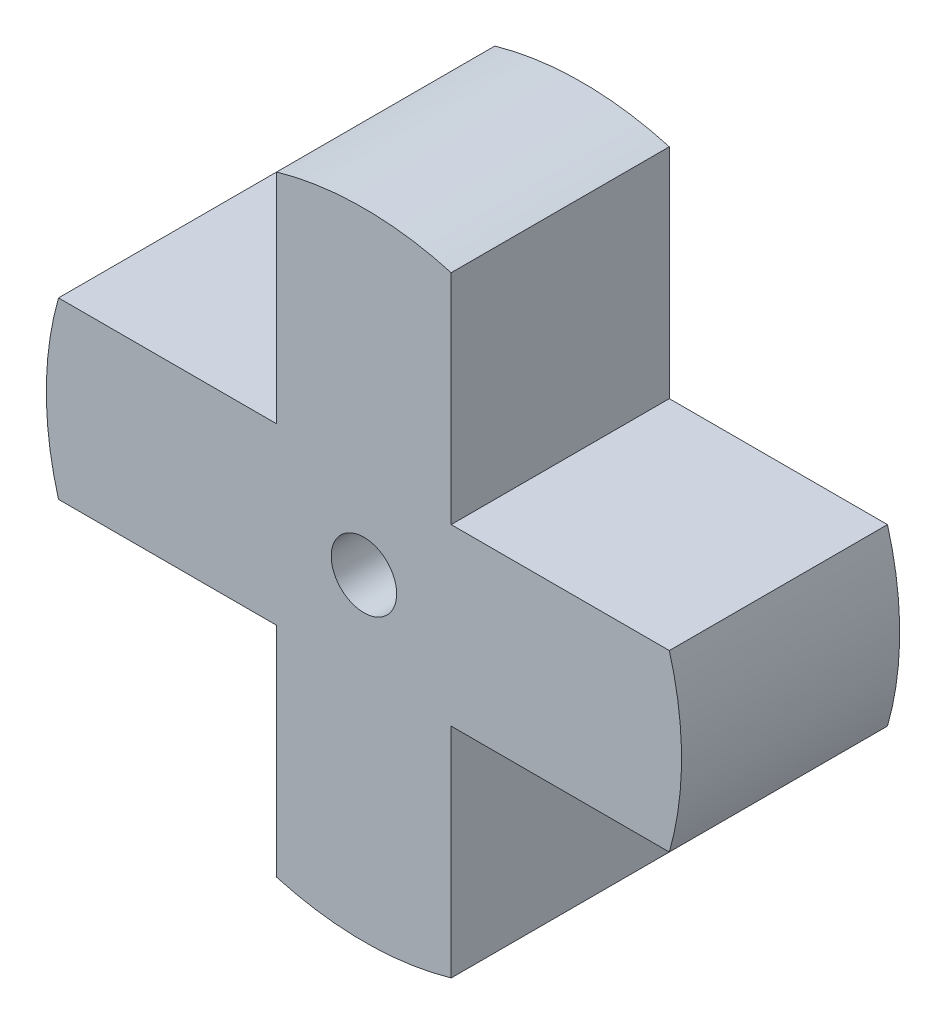
ISO-10303-21;
HEADER;
FILE_DESCRIPTION(('STEP AP214'),'2;1');
FILE_NAME('part.step','',(''),(''),'','','');
FILE_SCHEMA(('AUTOMOTIVE_DESIGN { 1 0 10303 214 1 1 1 1 }'));
ENDSEC;
DATA;
#1=APPLICATION_CONTEXT('core data for automotive mechanical design processes');
#2=APPLICATION_PROTOCOL_DEFINITION('international standard','automotive_design',2000,#1);
#3=PRODUCT_CONTEXT('',#1,'mechanical');
#4=PRODUCT('Part','Part','',(#3));
#5=PRODUCT_RELATED_PRODUCT_CATEGORY('part','',(#4));
#6=PRODUCT_DEFINITION_FORMATION('','',#4);
#7=PRODUCT_DEFINITION_CONTEXT('part definition',#1,'design');
#8=PRODUCT_DEFINITION('design','',#6,#7);
#9=PRODUCT_DEFINITION_SHAPE('','',#8);
#10=(LENGTH_UNIT() NAMED_UNIT(*) SI_UNIT(.MILLI.,.METRE.));
#11=(NAMED_UNIT(*) PLANE_ANGLE_UNIT() SI_UNIT($,.RADIAN.));
#12=(NAMED_UNIT(*) SI_UNIT($,.STERADIAN.) SOLID_ANGLE_UNIT());
#13=UNCERTAINTY_MEASURE_WITH_UNIT(LENGTH_MEASURE(1.E-05),#10,'distance_accuracy_value','');
#14=(GEOMETRIC_REPRESENTATION_CONTEXT(3) GLOBAL_UNCERTAINTY_ASSIGNED_CONTEXT((#13)) GLOBAL_UNIT_ASSIGNED_CONTEXT((#10,
#11,#12)) REPRESENTATION_CONTEXT('',''));
#15=CARTESIAN_POINT('',(0.,0.,0.));
#16=DIRECTION('',(0.,0.,1.));
#17=DIRECTION('',(1.,0.,0.));
#18=AXIS2_PLACEMENT_3D('',#15,#16,#17);
#19=CARTESIAN_POINT('',(0.,2.,5.));
#20=DIRECTION('',(0.,1.,0.));
#21=DIRECTION('',(0.,0.,1.));
#22=AXIS2_PLACEMENT_3D('',#19,#20,#21);
#23=PLANE('',#22);
#24=DIRECTION('',(1.,0.,0.));
#25=VECTOR('',#24,1.);
#26=CARTESIAN_POINT('',(0.,2.,0.));
#27=LINE('',#26,#25);
#28=CARTESIAN_POINT('',(-7.,2.,0.));
#29=VERTEX_POINT('',#28);
#30=CARTESIAN_POINT('',(-2.,2.,0.));
#31=VERTEX_POINT('',#30);
#32=EDGE_CURVE('E157',#29,#31,#27,.T.);
#33=ORIENTED_EDGE('',*,*,#32,.F.);
#34=DIRECTION('',(0.,0.,-1.));
#35=VECTOR('',#34,1.);
#36=CARTESIAN_POINT('',(-7.,2.,5.));
#37=LINE('',#36,#35);
#38=CARTESIAN_POINT('',(-7.,2.,5.));
#39=VERTEX_POINT('',#38);
#40=EDGE_CURVE('E11',#39,#29,#37,.T.);
#41=ORIENTED_EDGE('',*,*,#40,.F.);
#42=DIRECTION('',(1.,0.,0.));
#43=VECTOR('',#42,1.);
#44=CARTESIAN_POINT('',(0.,2.,5.));
#45=LINE('',#44,#43);
#46=CARTESIAN_POINT('',(-2.,2.,5.));
#47=VERTEX_POINT('',#46);
#48=EDGE_CURVE('E187',#39,#47,#45,.T.);
#49=ORIENTED_EDGE('',*,*,#48,.T.);
#50=DIRECTION('',(0.,0.,-1.));
#51=VECTOR('',#50,1.);
#52=CARTESIAN_POINT('',(-2.,2.,5.));
#53=LINE('',#52,#51);
#54=EDGE_CURVE('E97',#47,#31,#53,.T.);
#55=ORIENTED_EDGE('',*,*,#54,.T.);
#56=EDGE_LOOP('',(#33,#41,#49,#55));
#57=FACE_BOUND('',#56,.T.);
#58=ADVANCED_FACE('F35',(#57),#23,.T.);
#59=CARTESIAN_POINT('',(0.,0.,5.));
#60=DIRECTION('',(0.,0.,-1.));
#61=DIRECTION('',(-1.,0.,0.));
#62=AXIS2_PLACEMENT_3D('',#59,#60,#61);
#63=CYLINDRICAL_SURFACE('',#62,7.28010988928052);
#64=CARTESIAN_POINT('',(0.,0.,0.));
#65=DIRECTION('',(0.,0.,1.));
#66=DIRECTION('',(1.,0.,0.));
#67=AXIS2_PLACEMENT_3D('',#64,#65,#66);
#68=CIRCLE('',#67,7.28010988928052);
#69=CARTESIAN_POINT('',(-7.,-2.,0.));
#70=VERTEX_POINT('',#69);
#71=EDGE_CURVE('E160',#29,#70,#68,.T.);
#72=ORIENTED_EDGE('',*,*,#71,.T.);
#73=DIRECTION('',(0.,0.,-1.));
#74=VECTOR('',#73,1.);
#75=CARTESIAN_POINT('',(-7.,-2.,5.));
#76=LINE('',#75,#74);
#77=CARTESIAN_POINT('',(-7.,-2.,5.));
#78=VERTEX_POINT('',#77);
#79=EDGE_CURVE('E43',#78,#70,#76,.T.);
#80=ORIENTED_EDGE('',*,*,#79,.F.);
#81=CARTESIAN_POINT('',(0.,0.,5.));
#82=DIRECTION('',(0.,0.,1.));
#83=DIRECTION('',(1.,0.,0.));
#84=AXIS2_PLACEMENT_3D('',#81,#82,#83);
#85=CIRCLE('',#84,7.28010988928052);
#86=EDGE_CURVE('E231',#39,#78,#85,.T.);
#87=ORIENTED_EDGE('',*,*,#86,.F.);
#88=ORIENTED_EDGE('',*,*,#40,.T.);
#89=EDGE_LOOP('',(#72,#80,#87,#88));
#90=FACE_BOUND('',#89,.T.);
#91=ADVANCED_FACE('F251',(#90),#63,.T.);
#92=CARTESIAN_POINT('',(0.,-2.,5.));
#93=DIRECTION('',(0.,1.,0.));
#94=DIRECTION('',(0.,0.,1.));
#95=AXIS2_PLACEMENT_3D('',#92,#93,#94);
#96=PLANE('',#95);
#97=DIRECTION('',(1.,0.,0.));
#98=VECTOR('',#97,1.);
#99=CARTESIAN_POINT('',(0.,-2.,0.));
#100=LINE('',#99,#98);
#101=CARTESIAN_POINT('',(-2.,-2.,0.));
#102=VERTEX_POINT('',#101);
#103=EDGE_CURVE('E162',#70,#102,#100,.T.);
#104=ORIENTED_EDGE('',*,*,#103,.T.);
#105=DIRECTION('',(0.,0.,-1.));
#106=VECTOR('',#105,1.);
#107=CARTESIAN_POINT('',(-2.,-2.,5.));
#108=LINE('',#107,#106);
#109=CARTESIAN_POINT('',(-2.,-2.,5.));
#110=VERTEX_POINT('',#109);
#111=EDGE_CURVE('E204',#110,#102,#108,.T.);
#112=ORIENTED_EDGE('',*,*,#111,.F.);
#113=DIRECTION('',(1.,0.,0.));
#114=VECTOR('',#113,1.);
#115=CARTESIAN_POINT('',(0.,-2.,5.));
#116=LINE('',#115,#114);
#117=EDGE_CURVE('E212',#78,#110,#116,.T.);
#118=ORIENTED_EDGE('',*,*,#117,.F.);
#119=ORIENTED_EDGE('',*,*,#79,.T.);
#120=EDGE_LOOP('',(#104,#112,#118,#119));
#121=FACE_BOUND('',#120,.T.);
#122=ADVANCED_FACE('F210',(#121),#96,.F.);
#123=CARTESIAN_POINT('',(-2.,0.,5.));
#124=DIRECTION('',(-1.,0.,0.));
#125=DIRECTION('',(0.,0.,1.));
#126=AXIS2_PLACEMENT_3D('',#123,#124,#125);
#127=PLANE('',#126);
#128=DIRECTION('',(0.,1.,0.));
#129=VECTOR('',#128,1.);
#130=CARTESIAN_POINT('',(-2.,0.,0.));
#131=LINE('',#130,#129);
#132=CARTESIAN_POINT('',(-2.,-7.,0.));
#133=VERTEX_POINT('',#132);
#134=EDGE_CURVE('E165',#133,#102,#131,.T.);
#135=ORIENTED_EDGE('',*,*,#134,.F.);
#136=DIRECTION('',(0.,0.,-1.));
#137=VECTOR('',#136,1.);
#138=CARTESIAN_POINT('',(-2.,-7.,5.));
#139=LINE('',#138,#137);
#140=CARTESIAN_POINT('',(-2.,-7.,5.));
#141=VERTEX_POINT('',#140);
#142=EDGE_CURVE('E202',#141,#133,#139,.T.);
#143=ORIENTED_EDGE('',*,*,#142,.F.);
#144=DIRECTION('',(0.,1.,0.));
#145=VECTOR('',#144,1.);
#146=CARTESIAN_POINT('',(-2.,0.,5.));
#147=LINE('',#146,#145);
#148=EDGE_CURVE('E226',#141,#110,#147,.T.);
#149=ORIENTED_EDGE('',*,*,#148,.T.);
#150=ORIENTED_EDGE('',*,*,#111,.T.);
#151=EDGE_LOOP('',(#135,#143,#149,#150));
#152=FACE_BOUND('',#151,.T.);
#153=ADVANCED_FACE('F222',(#152),#127,.T.);
#154=CARTESIAN_POINT('',(0.,0.,5.));
#155=DIRECTION('',(0.,0.,-1.));
#156=DIRECTION('',(-1.,0.,0.));
#157=AXIS2_PLACEMENT_3D('',#154,#155,#156);
#158=CYLINDRICAL_SURFACE('',#157,7.28010988928052);
#159=CARTESIAN_POINT('',(0.,0.,0.));
#160=DIRECTION('',(0.,0.,1.));
#161=DIRECTION('',(1.,0.,0.));
#162=AXIS2_PLACEMENT_3D('',#159,#160,#161);
#163=CIRCLE('',#162,7.28010988928052);
#164=CARTESIAN_POINT('',(2.,-7.,0.));
#165=VERTEX_POINT('',#164);
#166=EDGE_CURVE('E168',#133,#165,#163,.T.);
#167=ORIENTED_EDGE('',*,*,#166,.T.);
#168=DIRECTION('',(0.,0.,-1.));
#169=VECTOR('',#168,1.);
#170=CARTESIAN_POINT('',(2.,-7.,5.));
#171=LINE('',#170,#169);
#172=CARTESIAN_POINT('',(2.,-7.,5.));
#173=VERTEX_POINT('',#172);
#174=EDGE_CURVE('E199',#173,#165,#171,.T.);
#175=ORIENTED_EDGE('',*,*,#174,.F.);
#176=CARTESIAN_POINT('',(0.,0.,5.));
#177=DIRECTION('',(0.,0.,1.));
#178=DIRECTION('',(1.,0.,0.));
#179=AXIS2_PLACEMENT_3D('',#176,#177,#178);
#180=CIRCLE('',#179,7.28010988928052);
#181=EDGE_CURVE('E227',#141,#173,#180,.T.);
#182=ORIENTED_EDGE('',*,*,#181,.F.);
#183=ORIENTED_EDGE('',*,*,#142,.T.);
#184=EDGE_LOOP('',(#167,#175,#182,#183));
#185=FACE_BOUND('',#184,.T.);
#186=ADVANCED_FACE('F261',(#185),#158,.T.);
#187=CARTESIAN_POINT('',(2.,0.,5.));
#188=DIRECTION('',(-1.,0.,0.));
#189=DIRECTION('',(0.,0.,1.));
#190=AXIS2_PLACEMENT_3D('',#187,#188,#189);
#191=PLANE('',#190);
#192=DIRECTION('',(0.,1.,0.));
#193=VECTOR('',#192,1.);
#194=CARTESIAN_POINT('',(2.,0.,0.));
#195=LINE('',#194,#193);
#196=CARTESIAN_POINT('',(2.,-2.,0.));
#197=VERTEX_POINT('',#196);
#198=EDGE_CURVE('E170',#165,#197,#195,.T.);
#199=ORIENTED_EDGE('',*,*,#198,.T.);
#200=DIRECTION('',(0.,0.,-1.));
#201=VECTOR('',#200,1.);
#202=CARTESIAN_POINT('',(2.,-2.,5.));
#203=LINE('',#202,#201);
#204=CARTESIAN_POINT('',(2.,-2.,5.));
#205=VERTEX_POINT('',#204);
#206=EDGE_CURVE('E196',#205,#197,#203,.T.);
#207=ORIENTED_EDGE('',*,*,#206,.F.);
#208=DIRECTION('',(0.,1.,0.));
#209=VECTOR('',#208,1.);
#210=CARTESIAN_POINT('',(2.,0.,5.));
#211=LINE('',#210,#209);
#212=EDGE_CURVE('E229',#173,#205,#211,.T.);
#213=ORIENTED_EDGE('',*,*,#212,.F.);
#214=ORIENTED_EDGE('',*,*,#174,.T.);
#215=EDGE_LOOP('',(#199,#207,#213,#214));
#216=FACE_BOUND('',#215,.T.);
#217=ADVANCED_FACE('F264',(#216),#191,.F.);
#218=CARTESIAN_POINT('',(0.,-2.,5.));
#219=DIRECTION('',(0.,1.,0.));
#220=DIRECTION('',(0.,0.,1.));
#221=AXIS2_PLACEMENT_3D('',#218,#219,#220);
#222=PLANE('',#221);
#223=DIRECTION('',(1.,0.,0.));
#224=VECTOR('',#223,1.);
#225=CARTESIAN_POINT('',(0.,-2.,0.));
#226=LINE('',#225,#224);
#227=CARTESIAN_POINT('',(7.,-2.,0.));
#228=VERTEX_POINT('',#227);
#229=EDGE_CURVE('E172',#197,#228,#226,.T.);
#230=ORIENTED_EDGE('',*,*,#229,.T.);
#231=DIRECTION('',(0.,0.,-1.));
#232=VECTOR('',#231,1.);
#233=CARTESIAN_POINT('',(7.,-2.,5.));
#234=LINE('',#233,#232);
#235=CARTESIAN_POINT('',(7.,-2.,5.));
#236=VERTEX_POINT('',#235);
#237=EDGE_CURVE('E193',#236,#228,#234,.T.);
#238=ORIENTED_EDGE('',*,*,#237,.F.);
#239=DIRECTION('',(1.,0.,0.));
#240=VECTOR('',#239,1.);
#241=CARTESIAN_POINT('',(0.,-2.,5.));
#242=LINE('',#241,#240);
#243=EDGE_CURVE('E236',#205,#236,#242,.T.);
#244=ORIENTED_EDGE('',*,*,#243,.F.);
#245=ORIENTED_EDGE('',*,*,#206,.T.);
#246=EDGE_LOOP('',(#230,#238,#244,#245));
#247=FACE_BOUND('',#246,.T.);
#248=ADVANCED_FACE('F268',(#247),#222,.F.);
#249=CARTESIAN_POINT('',(0.,0.,5.));
#250=DIRECTION('',(0.,0.,-1.));
#251=DIRECTION('',(-1.,0.,0.));
#252=AXIS2_PLACEMENT_3D('',#249,#250,#251);
#253=CYLINDRICAL_SURFACE('',#252,7.28010988928052);
#254=CARTESIAN_POINT('',(0.,0.,0.));
#255=DIRECTION('',(0.,0.,1.));
#256=DIRECTION('',(1.,0.,0.));
#257=AXIS2_PLACEMENT_3D('',#254,#255,#256);
#258=CIRCLE('',#257,7.28010988928052);
#259=CARTESIAN_POINT('',(7.,2.,0.));
#260=VERTEX_POINT('',#259);
#261=EDGE_CURVE('E174',#228,#260,#258,.T.);
#262=ORIENTED_EDGE('',*,*,#261,.T.);
#263=DIRECTION('',(0.,0.,-1.));
#264=VECTOR('',#263,1.);
#265=CARTESIAN_POINT('',(7.,2.,5.));
#266=LINE('',#265,#264);
#267=CARTESIAN_POINT('',(7.,2.,5.));
#268=VERTEX_POINT('',#267);
#269=EDGE_CURVE('E191',#268,#260,#266,.T.);
#270=ORIENTED_EDGE('',*,*,#269,.F.);
#271=CARTESIAN_POINT('',(0.,0.,5.));
#272=DIRECTION('',(0.,0.,1.));
#273=DIRECTION('',(1.,0.,0.));
#274=AXIS2_PLACEMENT_3D('',#271,#272,#273);
#275=CIRCLE('',#274,7.28010988928052);
#276=EDGE_CURVE('E149',#236,#268,#275,.T.);
#277=ORIENTED_EDGE('',*,*,#276,.F.);
#278=ORIENTED_EDGE('',*,*,#237,.T.);
#279=EDGE_LOOP('',(#262,#270,#277,#278));
#280=FACE_BOUND('',#279,.T.);
#281=ADVANCED_FACE('F242',(#280),#253,.T.);
#282=CARTESIAN_POINT('',(0.,2.,5.));
#283=DIRECTION('',(0.,1.,0.));
#284=DIRECTION('',(0.,0.,1.));
#285=AXIS2_PLACEMENT_3D('',#282,#283,#284);
#286=PLANE('',#285);
#287=DIRECTION('',(1.,0.,0.));
#288=VECTOR('',#287,1.);
#289=CARTESIAN_POINT('',(0.,2.,0.));
#290=LINE('',#289,#288);
#291=CARTESIAN_POINT('',(2.,2.,0.));
#292=VERTEX_POINT('',#291);
#293=EDGE_CURVE('E177',#292,#260,#290,.T.);
#294=ORIENTED_EDGE('',*,*,#293,.F.);
#295=DIRECTION('',(0.,0.,-1.));
#296=VECTOR('',#295,1.);
#297=CARTESIAN_POINT('',(2.,2.,5.));
#298=LINE('',#297,#296);
#299=CARTESIAN_POINT('',(2.,2.,5.));
#300=VERTEX_POINT('',#299);
#301=EDGE_CURVE('E137',#300,#292,#298,.T.);
#302=ORIENTED_EDGE('',*,*,#301,.F.);
#303=DIRECTION('',(1.,0.,0.));
#304=VECTOR('',#303,1.);
#305=CARTESIAN_POINT('',(0.,2.,5.));
#306=LINE('',#305,#304);
#307=EDGE_CURVE('E147',#300,#268,#306,.T.);
#308=ORIENTED_EDGE('',*,*,#307,.T.);
#309=ORIENTED_EDGE('',*,*,#269,.T.);
#310=EDGE_LOOP('',(#294,#302,#308,#309));
#311=FACE_BOUND('',#310,.T.);
#312=ADVANCED_FACE('F246',(#311),#286,.T.);
#313=CARTESIAN_POINT('',(2.,0.,5.));
#314=DIRECTION('',(1.,0.,0.));
#315=DIRECTION('',(0.,0.,-1.));
#316=AXIS2_PLACEMENT_3D('',#313,#314,#315);
#317=PLANE('',#316);
#318=DIRECTION('',(0.,-1.,0.));
#319=VECTOR('',#318,1.);
#320=CARTESIAN_POINT('',(2.,0.,0.));
#321=LINE('',#320,#319);
#322=CARTESIAN_POINT('',(2.,7.,0.));
#323=VERTEX_POINT('',#322);
#324=EDGE_CURVE('E136',#323,#292,#321,.T.);
#325=ORIENTED_EDGE('',*,*,#324,.F.);
#326=DIRECTION('',(0.,0.,-1.));
#327=VECTOR('',#326,1.);
#328=CARTESIAN_POINT('',(2.,7.,5.));
#329=LINE('',#328,#327);
#330=CARTESIAN_POINT('',(2.,7.,5.));
#331=VERTEX_POINT('',#330);
#332=EDGE_CURVE('E130',#331,#323,#329,.T.);
#333=ORIENTED_EDGE('',*,*,#332,.F.);
#334=DIRECTION('',(0.,-1.,0.));
#335=VECTOR('',#334,1.);
#336=CARTESIAN_POINT('',(2.,0.,5.));
#337=LINE('',#336,#335);
#338=EDGE_CURVE('E134',#331,#300,#337,.T.);
#339=ORIENTED_EDGE('',*,*,#338,.T.);
#340=ORIENTED_EDGE('',*,*,#301,.T.);
#341=EDGE_LOOP('',(#325,#333,#339,#340));
#342=FACE_BOUND('',#341,.T.);
#343=ADVANCED_FACE('F132',(#342),#317,.T.);
#344=CARTESIAN_POINT('',(0.,0.,5.));
#345=DIRECTION('',(0.,0.,-1.));
#346=DIRECTION('',(-1.,0.,0.));
#347=AXIS2_PLACEMENT_3D('',#344,#345,#346);
#348=CYLINDRICAL_SURFACE('',#347,7.28010988928052);
#349=CARTESIAN_POINT('',(0.,0.,0.));
#350=DIRECTION('',(0.,0.,1.));
#351=DIRECTION('',(1.,0.,0.));
#352=AXIS2_PLACEMENT_3D('',#349,#350,#351);
#353=CIRCLE('',#352,7.28010988928052);
#354=CARTESIAN_POINT('',(-2.,7.,0.));
#355=VERTEX_POINT('',#354);
#356=EDGE_CURVE('E90',#323,#355,#353,.T.);
#357=ORIENTED_EDGE('',*,*,#356,.T.);
#358=DIRECTION('',(0.,0.,-1.));
#359=VECTOR('',#358,1.);
#360=CARTESIAN_POINT('',(-2.,7.,5.));
#361=LINE('',#360,#359);
#362=CARTESIAN_POINT('',(-2.,7.,5.));
#363=VERTEX_POINT('',#362);
#364=EDGE_CURVE('E138',#363,#355,#361,.T.);
#365=ORIENTED_EDGE('',*,*,#364,.F.);
#366=CARTESIAN_POINT('',(0.,0.,5.));
#367=DIRECTION('',(0.,0.,1.));
#368=DIRECTION('',(1.,0.,0.));
#369=AXIS2_PLACEMENT_3D('',#366,#367,#368);
#370=CIRCLE('',#369,7.28010988928052);
#371=EDGE_CURVE('E140',#331,#363,#370,.T.);
#372=ORIENTED_EDGE('',*,*,#371,.F.);
#373=ORIENTED_EDGE('',*,*,#332,.T.);
#374=EDGE_LOOP('',(#357,#365,#372,#373));
#375=FACE_BOUND('',#374,.T.);
#376=ADVANCED_FACE('F141',(#375),#348,.T.);
#377=CARTESIAN_POINT('',(-2.,0.,5.));
#378=DIRECTION('',(1.,0.,0.));
#379=DIRECTION('',(0.,0.,-1.));
#380=AXIS2_PLACEMENT_3D('',#377,#378,#379);
#381=PLANE('',#380);
#382=DIRECTION('',(0.,-1.,0.));
#383=VECTOR('',#382,1.);
#384=CARTESIAN_POINT('',(-2.,0.,0.));
#385=LINE('',#384,#383);
#386=EDGE_CURVE('E182',#355,#31,#385,.T.);
#387=ORIENTED_EDGE('',*,*,#386,.T.);
#388=ORIENTED_EDGE('',*,*,#54,.F.);
#389=DIRECTION('',(0.,-1.,0.));
#390=VECTOR('',#389,1.);
#391=CARTESIAN_POINT('',(-2.,0.,5.));
#392=LINE('',#391,#390);
#393=EDGE_CURVE('E51',#363,#47,#392,.T.);
#394=ORIENTED_EDGE('',*,*,#393,.F.);
#395=ORIENTED_EDGE('',*,*,#364,.T.);
#396=EDGE_LOOP('',(#387,#388,#394,#395));
#397=FACE_BOUND('',#396,.T.);
#398=ADVANCED_FACE('F249',(#397),#381,.F.);
#399=CARTESIAN_POINT('',(0.,0.,5.));
#400=DIRECTION('',(0.,0.,-1.));
#401=DIRECTION('',(-1.,0.,0.));
#402=AXIS2_PLACEMENT_3D('',#399,#400,#401);
#403=CYLINDRICAL_SURFACE('',#402,0.75);
#404=CARTESIAN_POINT('',(0.,0.,5.));
#405=DIRECTION('',(0.,0.,1.));
#406=DIRECTION('',(1.,0.,0.));
#407=AXIS2_PLACEMENT_3D('',#404,#405,#406);
#408=CIRCLE('',#407,0.75);
#409=CARTESIAN_POINT('',(0.75,0.,5.));
#410=VERTEX_POINT('',#409);
#411=EDGE_CURVE('E154',#410,#410,#408,.T.);
#412=ORIENTED_EDGE('',*,*,#411,.T.);
#413=EDGE_LOOP('',(#412));
#414=FACE_BOUND('',#413,.T.);
#415=CARTESIAN_POINT('',(0.,0.,0.));
#416=DIRECTION('',(0.,0.,1.));
#417=DIRECTION('',(1.,0.,0.));
#418=AXIS2_PLACEMENT_3D('',#415,#416,#417);
#419=CIRCLE('',#418,0.75);
#420=CARTESIAN_POINT('',(0.75,0.,0.));
#421=VERTEX_POINT('',#420);
#422=EDGE_CURVE('E184',#421,#421,#419,.T.);
#423=ORIENTED_EDGE('',*,*,#422,.F.);
#424=EDGE_LOOP('',(#423));
#425=FACE_BOUND('',#424,.T.);
#426=ADVANCED_FACE('F283',(#414,#425),#403,.F.);
#427=CARTESIAN_POINT('',(0.,0.,5.));
#428=DIRECTION('',(0.,0.,1.));
#429=DIRECTION('',(1.,0.,0.));
#430=AXIS2_PLACEMENT_3D('',#427,#428,#429);
#431=PLANE('',#430);
#432=ORIENTED_EDGE('',*,*,#48,.F.);
#433=ORIENTED_EDGE('',*,*,#86,.T.);
#434=ORIENTED_EDGE('',*,*,#117,.T.);
#435=ORIENTED_EDGE('',*,*,#148,.F.);
#436=ORIENTED_EDGE('',*,*,#181,.T.);
#437=ORIENTED_EDGE('',*,*,#212,.T.);
#438=ORIENTED_EDGE('',*,*,#243,.T.);
#439=ORIENTED_EDGE('',*,*,#276,.T.);
#440=ORIENTED_EDGE('',*,*,#307,.F.);
#441=ORIENTED_EDGE('',*,*,#338,.F.);
#442=ORIENTED_EDGE('',*,*,#371,.T.);
#443=ORIENTED_EDGE('',*,*,#393,.T.);
#444=EDGE_LOOP('',(#432,#433,#434,#435,#436,#437,#438,#439,#440,#441,#442,#443));
#445=FACE_BOUND('',#444,.T.);
#446=ORIENTED_EDGE('',*,*,#411,.F.);
#447=EDGE_LOOP('',(#446));
#448=FACE_BOUND('',#447,.T.);
#449=ADVANCED_FACE('F144',(#445,#448),#431,.T.);
#450=CARTESIAN_POINT('',(0.,0.,0.));
#451=DIRECTION('',(0.,0.,1.));
#452=DIRECTION('',(1.,0.,0.));
#453=AXIS2_PLACEMENT_3D('',#450,#451,#452);
#454=PLANE('',#453);
#455=ORIENTED_EDGE('',*,*,#32,.T.);
#456=ORIENTED_EDGE('',*,*,#386,.F.);
#457=ORIENTED_EDGE('',*,*,#356,.F.);
#458=ORIENTED_EDGE('',*,*,#324,.T.);
#459=ORIENTED_EDGE('',*,*,#293,.T.);
#460=ORIENTED_EDGE('',*,*,#261,.F.);
#461=ORIENTED_EDGE('',*,*,#229,.F.);
#462=ORIENTED_EDGE('',*,*,#198,.F.);
#463=ORIENTED_EDGE('',*,*,#166,.F.);
#464=ORIENTED_EDGE('',*,*,#134,.T.);
#465=ORIENTED_EDGE('',*,*,#103,.F.);
#466=ORIENTED_EDGE('',*,*,#71,.F.);
#467=EDGE_LOOP('',(#455,#456,#457,#458,#459,#460,#461,#462,#463,#464,#465,#466));
#468=FACE_BOUND('',#467,.T.);
#469=ORIENTED_EDGE('',*,*,#422,.T.);
#470=EDGE_LOOP('',(#469));
#471=FACE_BOUND('',#470,.T.);
#472=ADVANCED_FACE('F216',(#468,#471),#454,.F.);
#473=CLOSED_SHELL('',(#58,#91,#122,#153,#186,#217,#248,#281,#312,#343,#376,#398,#426,#449,#472));
#474=MANIFOLD_SOLID_BREP('B2',#473);
#475=ADVANCED_BREP_SHAPE_REPRESENTATION('',(#18,#474),#14);
#476=SHAPE_DEFINITION_REPRESENTATION(#9,#475);
ENDSEC;
END-ISO-10303-21;
